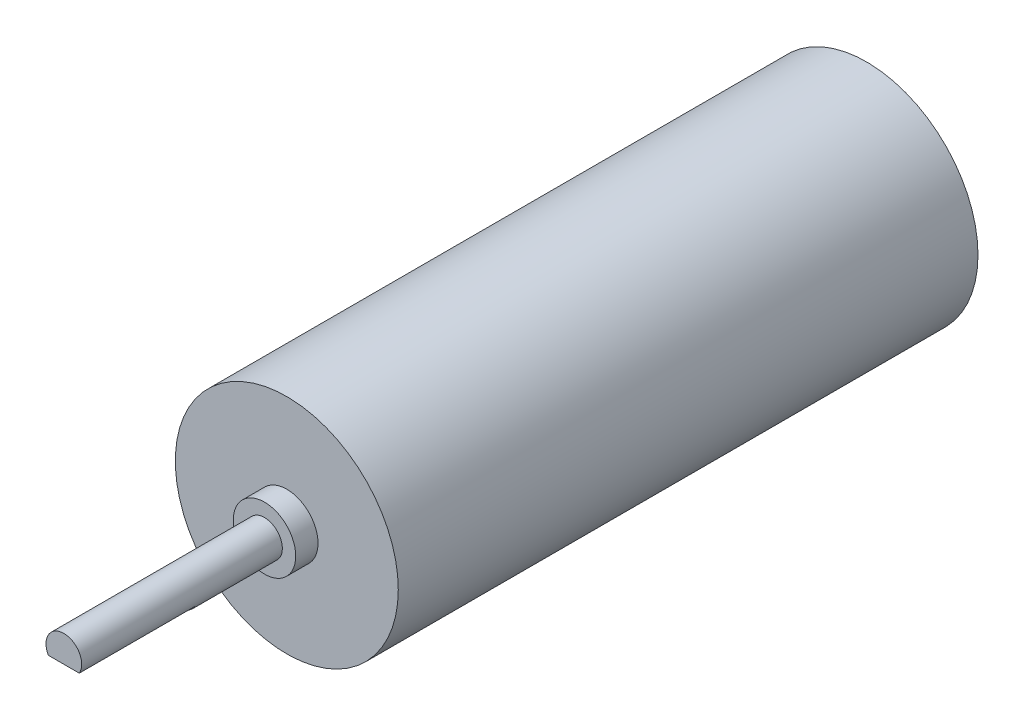
ISO-10303-21;
HEADER;
FILE_DESCRIPTION(('STEP AP214'),'2;1');
FILE_NAME('part.step','',(''),(''),'','','');
FILE_SCHEMA(('AUTOMOTIVE_DESIGN { 1 0 10303 214 1 1 1 1 }'));
ENDSEC;
DATA;
#1=APPLICATION_CONTEXT('core data for automotive mechanical design processes');
#2=APPLICATION_PROTOCOL_DEFINITION('international standard','automotive_design',2000,#1);
#3=PRODUCT_CONTEXT('',#1,'mechanical');
#4=PRODUCT('Part','Part','',(#3));
#5=PRODUCT_RELATED_PRODUCT_CATEGORY('part','',(#4));
#6=PRODUCT_DEFINITION_FORMATION('','',#4);
#7=PRODUCT_DEFINITION_CONTEXT('part definition',#1,'design');
#8=PRODUCT_DEFINITION('design','',#6,#7);
#9=PRODUCT_DEFINITION_SHAPE('','',#8);
#10=(LENGTH_UNIT() NAMED_UNIT(*) SI_UNIT(.MILLI.,.METRE.));
#11=(NAMED_UNIT(*) PLANE_ANGLE_UNIT() SI_UNIT($,.RADIAN.));
#12=(NAMED_UNIT(*) SI_UNIT($,.STERADIAN.) SOLID_ANGLE_UNIT());
#13=UNCERTAINTY_MEASURE_WITH_UNIT(LENGTH_MEASURE(1.E-05),#10,'distance_accuracy_value','');
#14=(GEOMETRIC_REPRESENTATION_CONTEXT(3) GLOBAL_UNCERTAINTY_ASSIGNED_CONTEXT((#13)) GLOBAL_UNIT_ASSIGNED_CONTEXT((#10,
#11,#12)) REPRESENTATION_CONTEXT('',''));
#15=CARTESIAN_POINT('',(0.,0.,0.));
#16=DIRECTION('',(0.,0.,1.));
#17=DIRECTION('',(1.,0.,0.));
#18=AXIS2_PLACEMENT_3D('',#15,#16,#17);
#19=CARTESIAN_POINT('',(0.,0.,-65.));
#20=DIRECTION('',(0.,0.,1.));
#21=DIRECTION('',(1.,0.,0.));
#22=AXIS2_PLACEMENT_3D('',#19,#20,#21);
#23=CYLINDRICAL_SURFACE('',#22,12.5);
#24=CARTESIAN_POINT('',(0.,0.,-65.));
#25=DIRECTION('',(0.,0.,1.));
#26=DIRECTION('',(1.,0.,0.));
#27=AXIS2_PLACEMENT_3D('',#24,#25,#26);
#28=CIRCLE('',#27,12.5);
#29=CARTESIAN_POINT('',(12.5,0.,-65.));
#30=VERTEX_POINT('',#29);
#31=EDGE_CURVE('E80',#30,#30,#28,.T.);
#32=ORIENTED_EDGE('',*,*,#31,.T.);
#33=EDGE_LOOP('',(#32));
#34=FACE_BOUND('',#33,.T.);
#35=CARTESIAN_POINT('',(0.,0.,0.));
#36=DIRECTION('',(0.,0.,1.));
#37=DIRECTION('',(1.,0.,0.));
#38=AXIS2_PLACEMENT_3D('',#35,#36,#37);
#39=CIRCLE('',#38,12.5);
#40=CARTESIAN_POINT('',(12.5,0.,0.));
#41=VERTEX_POINT('',#40);
#42=EDGE_CURVE('E35',#41,#41,#39,.T.);
#43=ORIENTED_EDGE('',*,*,#42,.F.);
#44=EDGE_LOOP('',(#43));
#45=FACE_BOUND('',#44,.T.);
#46=ADVANCED_FACE('F32',(#34,#45),#23,.T.);
#47=CARTESIAN_POINT('',(0.,0.,-65.));
#48=DIRECTION('',(0.,0.,1.));
#49=DIRECTION('',(1.,0.,0.));
#50=AXIS2_PLACEMENT_3D('',#47,#48,#49);
#51=PLANE('',#50);
#52=ORIENTED_EDGE('',*,*,#31,.F.);
#53=EDGE_LOOP('',(#52));
#54=FACE_BOUND('',#53,.T.);
#55=ADVANCED_FACE('F90',(#54),#51,.F.);
#56=CARTESIAN_POINT('',(0.,0.,0.));
#57=DIRECTION('',(0.,0.,1.));
#58=DIRECTION('',(1.,0.,0.));
#59=AXIS2_PLACEMENT_3D('',#56,#57,#58);
#60=PLANE('',#59);
#61=CARTESIAN_POINT('',(0.,0.,0.));
#62=DIRECTION('',(0.,0.,1.));
#63=DIRECTION('',(1.,0.,0.));
#64=AXIS2_PLACEMENT_3D('',#61,#62,#63);
#65=CIRCLE('',#64,3.5);
#66=CARTESIAN_POINT('',(3.5,0.,0.));
#67=VERTEX_POINT('',#66);
#68=EDGE_CURVE('E40',#67,#67,#65,.T.);
#69=ORIENTED_EDGE('',*,*,#68,.F.);
#70=EDGE_LOOP('',(#69));
#71=FACE_BOUND('',#70,.T.);
#72=ORIENTED_EDGE('',*,*,#42,.T.);
#73=EDGE_LOOP('',(#72));
#74=FACE_BOUND('',#73,.T.);
#75=ADVANCED_FACE('F87',(#71,#74),#60,.T.);
#76=CARTESIAN_POINT('',(0.,0.,2.5));
#77=DIRECTION('',(0.,0.,-1.));
#78=DIRECTION('',(-1.,0.,0.));
#79=AXIS2_PLACEMENT_3D('',#76,#77,#78);
#80=CYLINDRICAL_SURFACE('',#79,3.5);
#81=CARTESIAN_POINT('',(0.,0.,2.5));
#82=DIRECTION('',(0.,0.,1.));
#83=DIRECTION('',(1.,0.,0.));
#84=AXIS2_PLACEMENT_3D('',#81,#82,#83);
#85=CIRCLE('',#84,3.5);
#86=CARTESIAN_POINT('',(3.5,0.,2.5));
#87=VERTEX_POINT('',#86);
#88=EDGE_CURVE('E73',#87,#87,#85,.T.);
#89=ORIENTED_EDGE('',*,*,#88,.F.);
#90=EDGE_LOOP('',(#89));
#91=FACE_BOUND('',#90,.T.);
#92=ORIENTED_EDGE('',*,*,#68,.T.);
#93=EDGE_LOOP('',(#92));
#94=FACE_BOUND('',#93,.T.);
#95=ADVANCED_FACE('F99',(#91,#94),#80,.T.);
#96=CARTESIAN_POINT('',(0.,0.,2.5));
#97=DIRECTION('',(0.,0.,1.));
#98=DIRECTION('',(1.,0.,0.));
#99=AXIS2_PLACEMENT_3D('',#96,#97,#98);
#100=PLANE('',#99);
#101=CARTESIAN_POINT('',(0.,0.,2.5));
#102=DIRECTION('',(0.,0.,1.));
#103=DIRECTION('',(1.,0.,0.));
#104=AXIS2_PLACEMENT_3D('',#101,#102,#103);
#105=CIRCLE('',#104,2.);
#106=CARTESIAN_POINT('',(2.,0.,2.5));
#107=VERTEX_POINT('',#106);
#108=EDGE_CURVE('E11',#107,#107,#105,.T.);
#109=ORIENTED_EDGE('',*,*,#108,.F.);
#110=EDGE_LOOP('',(#109));
#111=FACE_BOUND('',#110,.T.);
#112=ORIENTED_EDGE('',*,*,#88,.T.);
#113=EDGE_LOOP('',(#112));
#114=FACE_BOUND('',#113,.T.);
#115=ADVANCED_FACE('F104',(#111,#114),#100,.T.);
#116=CARTESIAN_POINT('',(0.,0.,25.));
#117=DIRECTION('',(0.,0.,-1.));
#118=DIRECTION('',(-1.,0.,0.));
#119=AXIS2_PLACEMENT_3D('',#116,#117,#118);
#120=CYLINDRICAL_SURFACE('',#119,2.);
#121=CARTESIAN_POINT('',(0.,0.,25.));
#122=DIRECTION('',(0.,0.,1.));
#123=DIRECTION('',(1.,0.,0.));
#124=AXIS2_PLACEMENT_3D('',#121,#122,#123);
#125=CIRCLE('',#124,2.);
#126=CARTESIAN_POINT('',(1.73205080756888,-1.,25.));
#127=VERTEX_POINT('',#126);
#128=CARTESIAN_POINT('',(-1.73205080756888,-1.,25.));
#129=VERTEX_POINT('',#128);
#130=EDGE_CURVE('E70',#127,#129,#125,.T.);
#131=ORIENTED_EDGE('',*,*,#130,.F.);
#132=DIRECTION('',(0.,0.,1.));
#133=VECTOR('',#132,1.);
#134=CARTESIAN_POINT('',(1.73205080756888,-1.,12.));
#135=LINE('',#134,#133);
#136=CARTESIAN_POINT('',(1.73205080756888,-1.,12.));
#137=VERTEX_POINT('',#136);
#138=EDGE_CURVE('E48',#137,#127,#135,.T.);
#139=ORIENTED_EDGE('',*,*,#138,.F.);
#140=CARTESIAN_POINT('',(0.,0.,12.));
#141=DIRECTION('',(0.,0.,1.));
#142=DIRECTION('',(1.,0.,0.));
#143=AXIS2_PLACEMENT_3D('',#140,#141,#142);
#144=CIRCLE('',#143,2.);
#145=CARTESIAN_POINT('',(-1.73205080756888,-1.,12.));
#146=VERTEX_POINT('',#145);
#147=EDGE_CURVE('E64',#146,#137,#144,.T.);
#148=ORIENTED_EDGE('',*,*,#147,.F.);
#149=DIRECTION('',(0.,0.,1.));
#150=VECTOR('',#149,1.);
#151=CARTESIAN_POINT('',(-1.73205080756888,-1.,12.));
#152=LINE('',#151,#150);
#153=EDGE_CURVE('E54',#146,#129,#152,.T.);
#154=ORIENTED_EDGE('',*,*,#153,.T.);
#155=EDGE_LOOP('',(#131,#139,#148,#154));
#156=FACE_BOUND('',#155,.T.);
#157=ORIENTED_EDGE('',*,*,#108,.T.);
#158=EDGE_LOOP('',(#157));
#159=FACE_BOUND('',#158,.T.);
#160=ADVANCED_FACE('F68',(#156,#159),#120,.T.);
#161=CARTESIAN_POINT('',(0.,0.,25.));
#162=DIRECTION('',(0.,0.,1.));
#163=DIRECTION('',(1.,0.,0.));
#164=AXIS2_PLACEMENT_3D('',#161,#162,#163);
#165=PLANE('',#164);
#166=DIRECTION('',(-1.,0.,0.));
#167=VECTOR('',#166,1.);
#168=CARTESIAN_POINT('',(-1.73205080756888,-1.,25.));
#169=LINE('',#168,#167);
#170=EDGE_CURVE('E59',#127,#129,#169,.T.);
#171=ORIENTED_EDGE('',*,*,#170,.F.);
#172=ORIENTED_EDGE('',*,*,#130,.T.);
#173=EDGE_LOOP('',(#171,#172));
#174=FACE_BOUND('',#173,.T.);
#175=ADVANCED_FACE('F72',(#174),#165,.T.);
#176=CARTESIAN_POINT('',(-1.73205080756888,-1.,12.));
#177=DIRECTION('',(0.,1.,0.));
#178=DIRECTION('',(0.,0.,1.));
#179=AXIS2_PLACEMENT_3D('',#176,#177,#178);
#180=PLANE('',#179);
#181=ORIENTED_EDGE('',*,*,#170,.T.);
#182=ORIENTED_EDGE('',*,*,#153,.F.);
#183=DIRECTION('',(-1.,0.,0.));
#184=VECTOR('',#183,1.);
#185=CARTESIAN_POINT('',(-1.73205080756888,-1.,12.));
#186=LINE('',#185,#184);
#187=EDGE_CURVE('E120',#137,#146,#186,.T.);
#188=ORIENTED_EDGE('',*,*,#187,.F.);
#189=ORIENTED_EDGE('',*,*,#138,.T.);
#190=EDGE_LOOP('',(#181,#182,#188,#189));
#191=FACE_BOUND('',#190,.T.);
#192=ADVANCED_FACE('F60',(#191),#180,.F.);
#193=CARTESIAN_POINT('',(0.,0.,12.));
#194=DIRECTION('',(0.,0.,1.));
#195=DIRECTION('',(1.,0.,0.));
#196=AXIS2_PLACEMENT_3D('',#193,#194,#195);
#197=PLANE('',#196);
#198=ORIENTED_EDGE('',*,*,#147,.T.);
#199=ORIENTED_EDGE('',*,*,#187,.T.);
#200=EDGE_LOOP('',(#198,#199));
#201=FACE_BOUND('',#200,.T.);
#202=ADVANCED_FACE('F115',(#201),#197,.T.);
#203=CLOSED_SHELL('',(#46,#55,#75,#95,#115,#160,#175,#192,#202));
#204=MANIFOLD_SOLID_BREP('B2',#203);
#205=ADVANCED_BREP_SHAPE_REPRESENTATION('',(#18,#204),#14);
#206=SHAPE_DEFINITION_REPRESENTATION(#9,#205);
ENDSEC;
END-ISO-10303-21;
